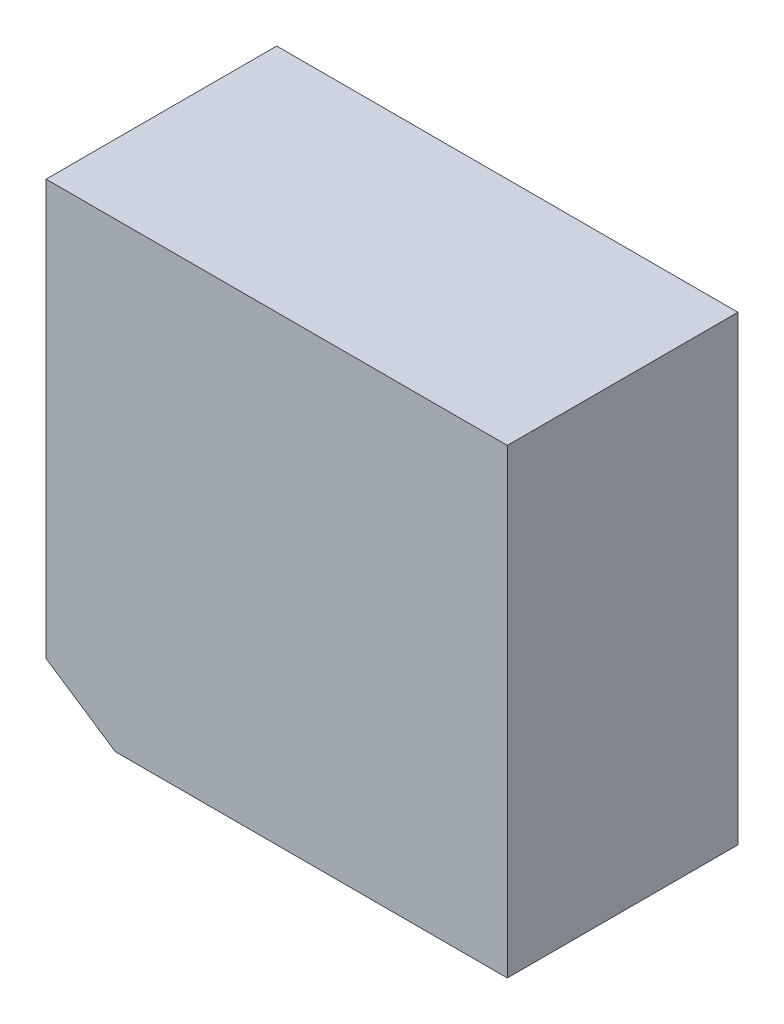
ISO-10303-21;
HEADER;
FILE_DESCRIPTION(('STEP AP214'),'2;1');
FILE_NAME('part.step','',(''),(''),'','','');
FILE_SCHEMA(('AUTOMOTIVE_DESIGN { 1 0 10303 214 1 1 1 1 }'));
ENDSEC;
DATA;
#1=APPLICATION_CONTEXT('core data for automotive mechanical design processes');
#2=APPLICATION_PROTOCOL_DEFINITION('international standard','automotive_design',2000,#1);
#3=PRODUCT_CONTEXT('',#1,'mechanical');
#4=PRODUCT('Part','Part','',(#3));
#5=PRODUCT_RELATED_PRODUCT_CATEGORY('part','',(#4));
#6=PRODUCT_DEFINITION_FORMATION('','',#4);
#7=PRODUCT_DEFINITION_CONTEXT('part definition',#1,'design');
#8=PRODUCT_DEFINITION('design','',#6,#7);
#9=PRODUCT_DEFINITION_SHAPE('','',#8);
#10=(LENGTH_UNIT() NAMED_UNIT(*) SI_UNIT(.MILLI.,.METRE.));
#11=(NAMED_UNIT(*) PLANE_ANGLE_UNIT() SI_UNIT($,.RADIAN.));
#12=(NAMED_UNIT(*) SI_UNIT($,.STERADIAN.) SOLID_ANGLE_UNIT());
#13=UNCERTAINTY_MEASURE_WITH_UNIT(LENGTH_MEASURE(1.E-05),#10,'distance_accuracy_value','');
#14=(GEOMETRIC_REPRESENTATION_CONTEXT(3) GLOBAL_UNCERTAINTY_ASSIGNED_CONTEXT((#13)) GLOBAL_UNIT_ASSIGNED_CONTEXT((#10,
#11,#12)) REPRESENTATION_CONTEXT('',''));
#15=CARTESIAN_POINT('',(0.,0.,0.));
#16=DIRECTION('',(0.,0.,1.));
#17=DIRECTION('',(1.,0.,0.));
#18=AXIS2_PLACEMENT_3D('',#15,#16,#17);
#19=CARTESIAN_POINT('',(0.,0.,10.));
#20=DIRECTION('',(1.,0.,0.));
#21=DIRECTION('',(0.,0.,-1.));
#22=AXIS2_PLACEMENT_3D('',#19,#20,#21);
#23=PLANE('',#22);
#24=DIRECTION('',(0.,-1.,0.));
#25=VECTOR('',#24,1.);
#26=CARTESIAN_POINT('',(0.,0.,0.));
#27=LINE('',#26,#25);
#28=CARTESIAN_POINT('',(0.,20.,0.));
#29=VERTEX_POINT('',#28);
#30=CARTESIAN_POINT('',(0.,2.00000000000001,0.));
#31=VERTEX_POINT('',#30);
#32=EDGE_CURVE('E123',#29,#31,#27,.T.);
#33=ORIENTED_EDGE('',*,*,#32,.T.);
#34=DIRECTION('',(0.,0.,1.));
#35=VECTOR('',#34,1.);
#36=CARTESIAN_POINT('',(0.,2.00000000000001,10.));
#37=LINE('',#36,#35);
#38=CARTESIAN_POINT('',(0.,2.00000000000001,10.));
#39=VERTEX_POINT('',#38);
#40=EDGE_CURVE('E52',#31,#39,#37,.T.);
#41=ORIENTED_EDGE('',*,*,#40,.T.);
#42=DIRECTION('',(0.,-1.,0.));
#43=VECTOR('',#42,1.);
#44=CARTESIAN_POINT('',(0.,0.,10.));
#45=LINE('',#44,#43);
#46=CARTESIAN_POINT('',(0.,20.,10.));
#47=VERTEX_POINT('',#46);
#48=EDGE_CURVE('E101',#47,#39,#45,.T.);
#49=ORIENTED_EDGE('',*,*,#48,.F.);
#50=DIRECTION('',(0.,0.,-1.));
#51=VECTOR('',#50,1.);
#52=CARTESIAN_POINT('',(0.,20.,10.));
#53=LINE('',#52,#51);
#54=EDGE_CURVE('E119',#47,#29,#53,.T.);
#55=ORIENTED_EDGE('',*,*,#54,.T.);
#56=EDGE_LOOP('',(#33,#41,#49,#55));
#57=FACE_BOUND('',#56,.T.);
#58=ADVANCED_FACE('F42',(#57),#23,.F.);
#59=CARTESIAN_POINT('',(0.,0.,10.));
#60=DIRECTION('',(0.,1.,0.));
#61=DIRECTION('',(0.,0.,1.));
#62=AXIS2_PLACEMENT_3D('',#59,#60,#61);
#63=PLANE('',#62);
#64=DIRECTION('',(1.,0.,0.));
#65=VECTOR('',#64,1.);
#66=CARTESIAN_POINT('',(0.,0.,10.));
#67=LINE('',#66,#65);
#68=CARTESIAN_POINT('',(3.00000000000002,0.,10.));
#69=VERTEX_POINT('',#68);
#70=CARTESIAN_POINT('',(20.,0.,10.));
#71=VERTEX_POINT('',#70);
#72=EDGE_CURVE('E93',#69,#71,#67,.T.);
#73=ORIENTED_EDGE('',*,*,#72,.F.);
#74=DIRECTION('',(0.,0.,-1.));
#75=VECTOR('',#74,1.);
#76=CARTESIAN_POINT('',(3.00000000000002,0.,10.));
#77=LINE('',#76,#75);
#78=CARTESIAN_POINT('',(3.00000000000002,0.,0.));
#79=VERTEX_POINT('',#78);
#80=EDGE_CURVE('E108',#69,#79,#77,.T.);
#81=ORIENTED_EDGE('',*,*,#80,.T.);
#82=DIRECTION('',(1.,0.,0.));
#83=VECTOR('',#82,1.);
#84=CARTESIAN_POINT('',(0.,0.,0.));
#85=LINE('',#84,#83);
#86=CARTESIAN_POINT('',(20.,0.,0.));
#87=VERTEX_POINT('',#86);
#88=EDGE_CURVE('E106',#79,#87,#85,.T.);
#89=ORIENTED_EDGE('',*,*,#88,.T.);
#90=DIRECTION('',(0.,0.,-1.));
#91=VECTOR('',#90,1.);
#92=CARTESIAN_POINT('',(20.,0.,10.));
#93=LINE('',#92,#91);
#94=EDGE_CURVE('E102',#71,#87,#93,.T.);
#95=ORIENTED_EDGE('',*,*,#94,.F.);
#96=EDGE_LOOP('',(#73,#81,#89,#95));
#97=FACE_BOUND('',#96,.T.);
#98=ADVANCED_FACE('F104',(#97),#63,.F.);
#99=CARTESIAN_POINT('',(20.,0.,10.));
#100=DIRECTION('',(-1.,0.,0.));
#101=DIRECTION('',(0.,0.,1.));
#102=AXIS2_PLACEMENT_3D('',#99,#100,#101);
#103=PLANE('',#102);
#104=DIRECTION('',(0.,1.,0.));
#105=VECTOR('',#104,1.);
#106=CARTESIAN_POINT('',(20.,0.,0.));
#107=LINE('',#106,#105);
#108=CARTESIAN_POINT('',(20.,20.,0.));
#109=VERTEX_POINT('',#108);
#110=EDGE_CURVE('E125',#87,#109,#107,.T.);
#111=ORIENTED_EDGE('',*,*,#110,.T.);
#112=DIRECTION('',(0.,0.,-1.));
#113=VECTOR('',#112,1.);
#114=CARTESIAN_POINT('',(20.,20.,10.));
#115=LINE('',#114,#113);
#116=CARTESIAN_POINT('',(20.,20.,10.));
#117=VERTEX_POINT('',#116);
#118=EDGE_CURVE('E109',#117,#109,#115,.T.);
#119=ORIENTED_EDGE('',*,*,#118,.F.);
#120=DIRECTION('',(0.,1.,0.));
#121=VECTOR('',#120,1.);
#122=CARTESIAN_POINT('',(20.,0.,10.));
#123=LINE('',#122,#121);
#124=EDGE_CURVE('E92',#71,#117,#123,.T.);
#125=ORIENTED_EDGE('',*,*,#124,.F.);
#126=ORIENTED_EDGE('',*,*,#94,.T.);
#127=EDGE_LOOP('',(#111,#119,#125,#126));
#128=FACE_BOUND('',#127,.T.);
#129=ADVANCED_FACE('F115',(#128),#103,.F.);
#130=CARTESIAN_POINT('',(0.,20.,10.));
#131=DIRECTION('',(0.,-1.,0.));
#132=DIRECTION('',(0.,0.,-1.));
#133=AXIS2_PLACEMENT_3D('',#130,#131,#132);
#134=PLANE('',#133);
#135=DIRECTION('',(-1.,0.,0.));
#136=VECTOR('',#135,1.);
#137=CARTESIAN_POINT('',(0.,20.,0.));
#138=LINE('',#137,#136);
#139=EDGE_CURVE('E127',#109,#29,#138,.T.);
#140=ORIENTED_EDGE('',*,*,#139,.T.);
#141=ORIENTED_EDGE('',*,*,#54,.F.);
#142=DIRECTION('',(-1.,0.,0.));
#143=VECTOR('',#142,1.);
#144=CARTESIAN_POINT('',(0.,20.,10.));
#145=LINE('',#144,#143);
#146=EDGE_CURVE('E113',#117,#47,#145,.T.);
#147=ORIENTED_EDGE('',*,*,#146,.F.);
#148=ORIENTED_EDGE('',*,*,#118,.T.);
#149=EDGE_LOOP('',(#140,#141,#147,#148));
#150=FACE_BOUND('',#149,.T.);
#151=ADVANCED_FACE('F136',(#150),#134,.F.);
#152=CARTESIAN_POINT('',(0.,0.,10.));
#153=DIRECTION('',(0.,0.,-1.));
#154=DIRECTION('',(-1.,0.,0.));
#155=AXIS2_PLACEMENT_3D('',#152,#153,#154);
#156=PLANE('',#155);
#157=ORIENTED_EDGE('',*,*,#48,.T.);
#158=DIRECTION('',(-0.832050294337844,0.554700196225228,0.));
#159=VECTOR('',#158,1.);
#160=CARTESIAN_POINT('',(3.00000000000002,0.,10.));
#161=LINE('',#160,#159);
#162=EDGE_CURVE('E11',#39,#69,#161,.F.);
#163=ORIENTED_EDGE('',*,*,#162,.T.);
#164=ORIENTED_EDGE('',*,*,#72,.T.);
#165=ORIENTED_EDGE('',*,*,#124,.T.);
#166=ORIENTED_EDGE('',*,*,#146,.T.);
#167=EDGE_LOOP('',(#157,#163,#164,#165,#166));
#168=FACE_BOUND('',#167,.T.);
#169=ADVANCED_FACE('F91',(#168),#156,.F.);
#170=CARTESIAN_POINT('',(0.,0.,0.));
#171=DIRECTION('',(0.,0.,-1.));
#172=DIRECTION('',(-1.,0.,0.));
#173=AXIS2_PLACEMENT_3D('',#170,#171,#172);
#174=PLANE('',#173);
#175=ORIENTED_EDGE('',*,*,#88,.F.);
#176=DIRECTION('',(0.832050294337844,-0.554700196225228,0.));
#177=VECTOR('',#176,1.);
#178=CARTESIAN_POINT('',(0.923076923076926,1.38461538461539,0.));
#179=LINE('',#178,#177);
#180=EDGE_CURVE('E69',#79,#31,#179,.F.);
#181=ORIENTED_EDGE('',*,*,#180,.T.);
#182=ORIENTED_EDGE('',*,*,#32,.F.);
#183=ORIENTED_EDGE('',*,*,#139,.F.);
#184=ORIENTED_EDGE('',*,*,#110,.F.);
#185=EDGE_LOOP('',(#175,#181,#182,#183,#184));
#186=FACE_BOUND('',#185,.T.);
#187=ADVANCED_FACE('F132',(#186),#174,.T.);
#188=CARTESIAN_POINT('',(3.00000000000002,0.,10.));
#189=DIRECTION('',(0.554700196225228,0.832050294337844,0.));
#190=DIRECTION('',(0.,0.,-1.));
#191=AXIS2_PLACEMENT_3D('',#188,#189,#190);
#192=PLANE('',#191);
#193=ORIENTED_EDGE('',*,*,#162,.F.);
#194=ORIENTED_EDGE('',*,*,#40,.F.);
#195=ORIENTED_EDGE('',*,*,#180,.F.);
#196=ORIENTED_EDGE('',*,*,#80,.F.);
#197=EDGE_LOOP('',(#193,#194,#195,#196));
#198=FACE_BOUND('',#197,.T.);
#199=ADVANCED_FACE('F50',(#198),#192,.F.);
#200=CLOSED_SHELL('',(#58,#98,#129,#151,#169,#187,#199));
#201=MANIFOLD_SOLID_BREP('B2',#200);
#202=ADVANCED_BREP_SHAPE_REPRESENTATION('',(#18,#201),#14);
#203=SHAPE_DEFINITION_REPRESENTATION(#9,#202);
ENDSEC;
END-ISO-10303-21;
